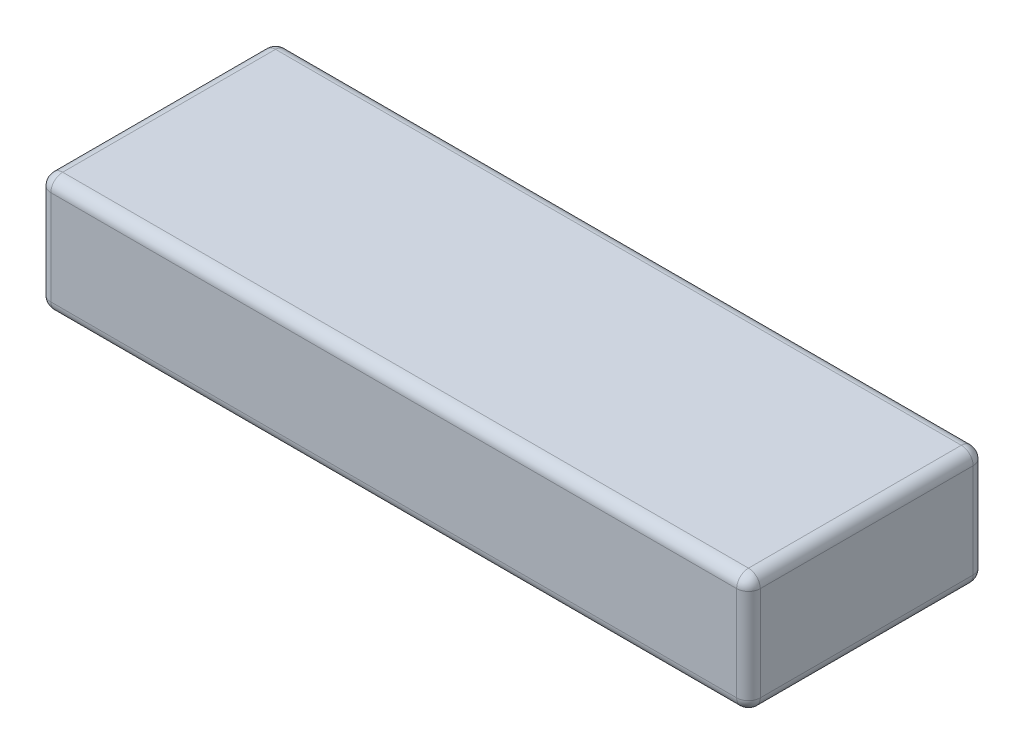
ISO-10303-21;
HEADER;
FILE_DESCRIPTION(('STEP AP214'),'2;1');
FILE_NAME('part.step','',(''),(''),'','','');
FILE_SCHEMA(('AUTOMOTIVE_DESIGN { 1 0 10303 214 1 1 1 1 }'));
ENDSEC;
DATA;
#1=APPLICATION_CONTEXT('core data for automotive mechanical design processes');
#2=APPLICATION_PROTOCOL_DEFINITION('international standard','automotive_design',2000,#1);
#3=PRODUCT_CONTEXT('',#1,'mechanical');
#4=PRODUCT('Part','Part','',(#3));
#5=PRODUCT_RELATED_PRODUCT_CATEGORY('part','',(#4));
#6=PRODUCT_DEFINITION_FORMATION('','',#4);
#7=PRODUCT_DEFINITION_CONTEXT('part definition',#1,'design');
#8=PRODUCT_DEFINITION('design','',#6,#7);
#9=PRODUCT_DEFINITION_SHAPE('','',#8);
#10=(LENGTH_UNIT() NAMED_UNIT(*) SI_UNIT(.MILLI.,.METRE.));
#11=(NAMED_UNIT(*) PLANE_ANGLE_UNIT() SI_UNIT($,.RADIAN.));
#12=(NAMED_UNIT(*) SI_UNIT($,.STERADIAN.) SOLID_ANGLE_UNIT());
#13=UNCERTAINTY_MEASURE_WITH_UNIT(LENGTH_MEASURE(1.E-05),#10,'distance_accuracy_value','');
#14=(GEOMETRIC_REPRESENTATION_CONTEXT(3) GLOBAL_UNCERTAINTY_ASSIGNED_CONTEXT((#13)) GLOBAL_UNIT_ASSIGNED_CONTEXT((#10,
#11,#12)) REPRESENTATION_CONTEXT('',''));
#15=CARTESIAN_POINT('',(0.,0.,0.));
#16=DIRECTION('',(0.,0.,1.));
#17=DIRECTION('',(1.,0.,0.));
#18=AXIS2_PLACEMENT_3D('',#15,#16,#17);
#19=CARTESIAN_POINT('',(30.,5.,-10.));
#20=DIRECTION('',(-1.,0.,0.));
#21=DIRECTION('',(0.,0.,1.));
#22=AXIS2_PLACEMENT_3D('',#19,#20,#21);
#23=PLANE('',#22);
#24=DIRECTION('',(0.,0.,-1.));
#25=VECTOR('',#24,1.);
#26=CARTESIAN_POINT('',(30.,4.,10.));
#27=LINE('',#26,#25);
#28=CARTESIAN_POINT('',(30.,4.,-9.));
#29=VERTEX_POINT('',#28);
#30=CARTESIAN_POINT('',(30.,4.,9.));
#31=VERTEX_POINT('',#30);
#32=EDGE_CURVE('E50',#29,#31,#27,.F.);
#33=ORIENTED_EDGE('',*,*,#32,.T.);
#34=DIRECTION('',(0.,-1.,0.));
#35=VECTOR('',#34,1.);
#36=CARTESIAN_POINT('',(30.,5.,9.));
#37=LINE('',#36,#35);
#38=CARTESIAN_POINT('',(30.,-4.,9.));
#39=VERTEX_POINT('',#38);
#40=EDGE_CURVE('E11',#31,#39,#37,.T.);
#41=ORIENTED_EDGE('',*,*,#40,.T.);
#42=DIRECTION('',(0.,0.,-1.));
#43=VECTOR('',#42,1.);
#44=CARTESIAN_POINT('',(30.,-4.,-10.));
#45=LINE('',#44,#43);
#46=CARTESIAN_POINT('',(30.,-4.,-9.));
#47=VERTEX_POINT('',#46);
#48=EDGE_CURVE('E226',#39,#47,#45,.T.);
#49=ORIENTED_EDGE('',*,*,#48,.T.);
#50=DIRECTION('',(0.,-1.,0.));
#51=VECTOR('',#50,1.);
#52=CARTESIAN_POINT('',(30.,5.,-9.));
#53=LINE('',#52,#51);
#54=EDGE_CURVE('E61',#47,#29,#53,.F.);
#55=ORIENTED_EDGE('',*,*,#54,.T.);
#56=EDGE_LOOP('',(#33,#41,#49,#55));
#57=FACE_BOUND('',#56,.T.);
#58=ADVANCED_FACE('F40',(#57),#23,.F.);
#59=CARTESIAN_POINT('',(-30.,5.,-10.));
#60=DIRECTION('',(0.,0.,1.));
#61=DIRECTION('',(1.,0.,0.));
#62=AXIS2_PLACEMENT_3D('',#59,#60,#61);
#63=PLANE('',#62);
#64=DIRECTION('',(0.,-1.,0.));
#65=VECTOR('',#64,1.);
#66=CARTESIAN_POINT('',(-29.,5.,-10.));
#67=LINE('',#66,#65);
#68=CARTESIAN_POINT('',(-29.,-4.,-10.));
#69=VERTEX_POINT('',#68);
#70=CARTESIAN_POINT('',(-29.,4.,-10.));
#71=VERTEX_POINT('',#70);
#72=EDGE_CURVE('E219',#69,#71,#67,.F.);
#73=ORIENTED_EDGE('',*,*,#72,.T.);
#74=DIRECTION('',(-1.,0.,0.));
#75=VECTOR('',#74,1.);
#76=CARTESIAN_POINT('',(30.,4.,-10.));
#77=LINE('',#76,#75);
#78=CARTESIAN_POINT('',(29.,4.,-10.));
#79=VERTEX_POINT('',#78);
#80=EDGE_CURVE('E222',#71,#79,#77,.F.);
#81=ORIENTED_EDGE('',*,*,#80,.T.);
#82=DIRECTION('',(0.,-1.,0.));
#83=VECTOR('',#82,1.);
#84=CARTESIAN_POINT('',(29.,5.,-10.));
#85=LINE('',#84,#83);
#86=CARTESIAN_POINT('',(29.,-4.,-10.));
#87=VERTEX_POINT('',#86);
#88=EDGE_CURVE('E213',#79,#87,#85,.T.);
#89=ORIENTED_EDGE('',*,*,#88,.T.);
#90=DIRECTION('',(-1.,0.,0.));
#91=VECTOR('',#90,1.);
#92=CARTESIAN_POINT('',(-30.,-4.,-10.));
#93=LINE('',#92,#91);
#94=EDGE_CURVE('E216',#87,#69,#93,.T.);
#95=ORIENTED_EDGE('',*,*,#94,.T.);
#96=EDGE_LOOP('',(#73,#81,#89,#95));
#97=FACE_BOUND('',#96,.T.);
#98=ADVANCED_FACE('F359',(#97),#63,.F.);
#99=CARTESIAN_POINT('',(-30.,5.,-10.));
#100=DIRECTION('',(1.,0.,0.));
#101=DIRECTION('',(0.,0.,-1.));
#102=AXIS2_PLACEMENT_3D('',#99,#100,#101);
#103=PLANE('',#102);
#104=DIRECTION('',(0.,-1.,0.));
#105=VECTOR('',#104,1.);
#106=CARTESIAN_POINT('',(-30.,5.,9.));
#107=LINE('',#106,#105);
#108=CARTESIAN_POINT('',(-30.,-4.,9.));
#109=VERTEX_POINT('',#108);
#110=CARTESIAN_POINT('',(-30.,4.,9.));
#111=VERTEX_POINT('',#110);
#112=EDGE_CURVE('E206',#109,#111,#107,.F.);
#113=ORIENTED_EDGE('',*,*,#112,.T.);
#114=DIRECTION('',(0.,0.,1.));
#115=VECTOR('',#114,1.);
#116=CARTESIAN_POINT('',(-30.,4.,-10.));
#117=LINE('',#116,#115);
#118=CARTESIAN_POINT('',(-30.,4.,-9.));
#119=VERTEX_POINT('',#118);
#120=EDGE_CURVE('E209',#111,#119,#117,.F.);
#121=ORIENTED_EDGE('',*,*,#120,.T.);
#122=DIRECTION('',(0.,-1.,0.));
#123=VECTOR('',#122,1.);
#124=CARTESIAN_POINT('',(-30.,5.,-9.));
#125=LINE('',#124,#123);
#126=CARTESIAN_POINT('',(-30.,-4.,-9.));
#127=VERTEX_POINT('',#126);
#128=EDGE_CURVE('E200',#119,#127,#125,.T.);
#129=ORIENTED_EDGE('',*,*,#128,.T.);
#130=DIRECTION('',(0.,0.,1.));
#131=VECTOR('',#130,1.);
#132=CARTESIAN_POINT('',(-30.,-4.,-10.));
#133=LINE('',#132,#131);
#134=EDGE_CURVE('E203',#127,#109,#133,.T.);
#135=ORIENTED_EDGE('',*,*,#134,.T.);
#136=EDGE_LOOP('',(#113,#121,#129,#135));
#137=FACE_BOUND('',#136,.T.);
#138=ADVANCED_FACE('F330',(#137),#103,.F.);
#139=CARTESIAN_POINT('',(-30.,5.,10.));
#140=DIRECTION('',(0.,0.,-1.));
#141=DIRECTION('',(-1.,0.,0.));
#142=AXIS2_PLACEMENT_3D('',#139,#140,#141);
#143=PLANE('',#142);
#144=DIRECTION('',(1.,0.,0.));
#145=VECTOR('',#144,1.);
#146=CARTESIAN_POINT('',(-30.,4.,10.));
#147=LINE('',#146,#145);
#148=CARTESIAN_POINT('',(29.,4.,10.));
#149=VERTEX_POINT('',#148);
#150=CARTESIAN_POINT('',(-29.,4.,10.));
#151=VERTEX_POINT('',#150);
#152=EDGE_CURVE('E162',#149,#151,#147,.F.);
#153=ORIENTED_EDGE('',*,*,#152,.T.);
#154=DIRECTION('',(0.,-1.,0.));
#155=VECTOR('',#154,1.);
#156=CARTESIAN_POINT('',(-29.,5.,10.));
#157=LINE('',#156,#155);
#158=CARTESIAN_POINT('',(-29.,-4.,10.));
#159=VERTEX_POINT('',#158);
#160=EDGE_CURVE('E166',#151,#159,#157,.T.);
#161=ORIENTED_EDGE('',*,*,#160,.T.);
#162=DIRECTION('',(1.,0.,0.));
#163=VECTOR('',#162,1.);
#164=CARTESIAN_POINT('',(-30.,-4.,10.));
#165=LINE('',#164,#163);
#166=CARTESIAN_POINT('',(29.,-4.,10.));
#167=VERTEX_POINT('',#166);
#168=EDGE_CURVE('E135',#159,#167,#165,.T.);
#169=ORIENTED_EDGE('',*,*,#168,.T.);
#170=DIRECTION('',(0.,-1.,0.));
#171=VECTOR('',#170,1.);
#172=CARTESIAN_POINT('',(29.,5.,10.));
#173=LINE('',#172,#171);
#174=EDGE_CURVE('E155',#167,#149,#173,.F.);
#175=ORIENTED_EDGE('',*,*,#174,.T.);
#176=EDGE_LOOP('',(#153,#161,#169,#175));
#177=FACE_BOUND('',#176,.T.);
#178=ADVANCED_FACE('F164',(#177),#143,.F.);
#179=CARTESIAN_POINT('',(0.,5.,0.));
#180=DIRECTION('',(0.,1.,0.));
#181=DIRECTION('',(0.,0.,1.));
#182=AXIS2_PLACEMENT_3D('',#179,#180,#181);
#183=PLANE('',#182);
#184=DIRECTION('',(0.,0.,1.));
#185=VECTOR('',#184,1.);
#186=CARTESIAN_POINT('',(-29.,5.,10.));
#187=LINE('',#186,#185);
#188=CARTESIAN_POINT('',(-29.,5.,-9.));
#189=VERTEX_POINT('',#188);
#190=CARTESIAN_POINT('',(-29.,5.,9.));
#191=VERTEX_POINT('',#190);
#192=EDGE_CURVE('E193',#189,#191,#187,.T.);
#193=ORIENTED_EDGE('',*,*,#192,.T.);
#194=DIRECTION('',(1.,0.,0.));
#195=VECTOR('',#194,1.);
#196=CARTESIAN_POINT('',(30.,5.,9.));
#197=LINE('',#196,#195);
#198=CARTESIAN_POINT('',(29.,5.,9.));
#199=VERTEX_POINT('',#198);
#200=EDGE_CURVE('E196',#191,#199,#197,.T.);
#201=ORIENTED_EDGE('',*,*,#200,.T.);
#202=DIRECTION('',(0.,0.,-1.));
#203=VECTOR('',#202,1.);
#204=CARTESIAN_POINT('',(29.,5.,-10.));
#205=LINE('',#204,#203);
#206=CARTESIAN_POINT('',(29.,5.,-9.));
#207=VERTEX_POINT('',#206);
#208=EDGE_CURVE('E187',#199,#207,#205,.T.);
#209=ORIENTED_EDGE('',*,*,#208,.T.);
#210=DIRECTION('',(-1.,0.,0.));
#211=VECTOR('',#210,1.);
#212=CARTESIAN_POINT('',(-30.,5.,-9.));
#213=LINE('',#212,#211);
#214=EDGE_CURVE('E190',#207,#189,#213,.T.);
#215=ORIENTED_EDGE('',*,*,#214,.T.);
#216=EDGE_LOOP('',(#193,#201,#209,#215));
#217=FACE_BOUND('',#216,.T.);
#218=ADVANCED_FACE('F425',(#217),#183,.T.);
#219=CARTESIAN_POINT('',(0.,-5.,0.));
#220=DIRECTION('',(0.,1.,0.));
#221=DIRECTION('',(0.,0.,1.));
#222=AXIS2_PLACEMENT_3D('',#219,#220,#221);
#223=PLANE('',#222);
#224=DIRECTION('',(0.,0.,-1.));
#225=VECTOR('',#224,1.);
#226=CARTESIAN_POINT('',(29.,-5.,0.));
#227=LINE('',#226,#225);
#228=CARTESIAN_POINT('',(29.,-5.,-9.));
#229=VERTEX_POINT('',#228);
#230=CARTESIAN_POINT('',(29.,-5.,9.));
#231=VERTEX_POINT('',#230);
#232=EDGE_CURVE('E173',#229,#231,#227,.F.);
#233=ORIENTED_EDGE('',*,*,#232,.T.);
#234=DIRECTION('',(1.,0.,0.));
#235=VECTOR('',#234,1.);
#236=CARTESIAN_POINT('',(0.,-5.,9.));
#237=LINE('',#236,#235);
#238=CARTESIAN_POINT('',(-29.,-5.,9.));
#239=VERTEX_POINT('',#238);
#240=EDGE_CURVE('E137',#231,#239,#237,.F.);
#241=ORIENTED_EDGE('',*,*,#240,.T.);
#242=DIRECTION('',(0.,0.,1.));
#243=VECTOR('',#242,1.);
#244=CARTESIAN_POINT('',(-29.,-5.,0.));
#245=LINE('',#244,#243);
#246=CARTESIAN_POINT('',(-29.,-5.,-9.));
#247=VERTEX_POINT('',#246);
#248=EDGE_CURVE('E182',#239,#247,#245,.F.);
#249=ORIENTED_EDGE('',*,*,#248,.T.);
#250=DIRECTION('',(-1.,0.,0.));
#251=VECTOR('',#250,1.);
#252=CARTESIAN_POINT('',(0.,-5.,-9.));
#253=LINE('',#252,#251);
#254=EDGE_CURVE('E179',#247,#229,#253,.F.);
#255=ORIENTED_EDGE('',*,*,#254,.T.);
#256=EDGE_LOOP('',(#233,#241,#249,#255));
#257=FACE_BOUND('',#256,.T.);
#258=ADVANCED_FACE('F352',(#257),#223,.F.);
#259=CARTESIAN_POINT('',(0.,4.,-9.));
#260=DIRECTION('',(1.,0.,0.));
#261=DIRECTION('',(0.,0.,-1.));
#262=AXIS2_PLACEMENT_3D('',#259,#260,#261);
#263=CYLINDRICAL_SURFACE('',#262,1.);
#264=CARTESIAN_POINT('',(-29.,4.,-9.));
#265=DIRECTION('',(-1.,0.,0.));
#266=DIRECTION('',(0.,0.,1.));
#267=AXIS2_PLACEMENT_3D('',#264,#265,#266);
#268=CIRCLE('',#267,1.);
#269=EDGE_CURVE('E44',#189,#71,#268,.T.);
#270=ORIENTED_EDGE('',*,*,#269,.F.);
#271=ORIENTED_EDGE('',*,*,#214,.F.);
#272=CARTESIAN_POINT('',(29.,4.,-9.));
#273=DIRECTION('',(1.,0.,0.));
#274=DIRECTION('',(0.,0.,-1.));
#275=AXIS2_PLACEMENT_3D('',#272,#273,#274);
#276=CIRCLE('',#275,1.);
#277=EDGE_CURVE('E303',#79,#207,#276,.T.);
#278=ORIENTED_EDGE('',*,*,#277,.F.);
#279=ORIENTED_EDGE('',*,*,#80,.F.);
#280=EDGE_LOOP('',(#270,#271,#278,#279));
#281=FACE_BOUND('',#280,.T.);
#282=ADVANCED_FACE('F42',(#281),#263,.T.);
#283=CARTESIAN_POINT('',(-29.,4.,-9.));
#284=DIRECTION('',(0.,0.,-1.));
#285=DIRECTION('',(-1.,0.,0.));
#286=AXIS2_PLACEMENT_3D('',#283,#284,#285);
#287=SPHERICAL_SURFACE('',#286,1.);
#288=CARTESIAN_POINT('',(-29.,4.,-9.));
#289=DIRECTION('',(0.,0.,-1.));
#290=DIRECTION('',(-1.,0.,0.));
#291=AXIS2_PLACEMENT_3D('',#288,#289,#290);
#292=CIRCLE('',#291,1.);
#293=EDGE_CURVE('E296',#189,#119,#292,.F.);
#294=ORIENTED_EDGE('',*,*,#293,.F.);
#295=ORIENTED_EDGE('',*,*,#269,.T.);
#296=CARTESIAN_POINT('',(-29.,4.,-9.));
#297=DIRECTION('',(0.,1.,0.));
#298=DIRECTION('',(0.,0.,1.));
#299=AXIS2_PLACEMENT_3D('',#296,#297,#298);
#300=CIRCLE('',#299,1.);
#301=EDGE_CURVE('E300',#119,#71,#300,.F.);
#302=ORIENTED_EDGE('',*,*,#301,.F.);
#303=EDGE_LOOP('',(#294,#295,#302));
#304=FACE_BOUND('',#303,.T.);
#305=ADVANCED_FACE('F318',(#304),#287,.T.);
#306=CARTESIAN_POINT('',(29.,4.,-9.));
#307=DIRECTION('',(0.,1.,0.));
#308=DIRECTION('',(0.,0.,1.));
#309=AXIS2_PLACEMENT_3D('',#306,#307,#308);
#310=SPHERICAL_SURFACE('',#309,1.);
#311=CARTESIAN_POINT('',(29.,4.,-9.));
#312=DIRECTION('',(0.,1.,0.));
#313=DIRECTION('',(0.,0.,1.));
#314=AXIS2_PLACEMENT_3D('',#311,#312,#313);
#315=CIRCLE('',#314,1.);
#316=EDGE_CURVE('E289',#79,#29,#315,.F.);
#317=ORIENTED_EDGE('',*,*,#316,.F.);
#318=ORIENTED_EDGE('',*,*,#277,.T.);
#319=CARTESIAN_POINT('',(29.,4.,-9.));
#320=DIRECTION('',(0.,0.,-1.));
#321=DIRECTION('',(-1.,0.,0.));
#322=AXIS2_PLACEMENT_3D('',#319,#320,#321);
#323=CIRCLE('',#322,1.);
#324=EDGE_CURVE('E292',#29,#207,#323,.F.);
#325=ORIENTED_EDGE('',*,*,#324,.F.);
#326=EDGE_LOOP('',(#317,#318,#325));
#327=FACE_BOUND('',#326,.T.);
#328=ADVANCED_FACE('F416',(#327),#310,.T.);
#329=CARTESIAN_POINT('',(-29.,5.,-9.));
#330=DIRECTION('',(0.,-1.,0.));
#331=DIRECTION('',(0.,0.,-1.));
#332=AXIS2_PLACEMENT_3D('',#329,#330,#331);
#333=CYLINDRICAL_SURFACE('',#332,1.);
#334=ORIENTED_EDGE('',*,*,#301,.T.);
#335=ORIENTED_EDGE('',*,*,#72,.F.);
#336=CARTESIAN_POINT('',(-29.,-4.,-9.));
#337=DIRECTION('',(0.,-1.,0.));
#338=DIRECTION('',(0.,0.,-1.));
#339=AXIS2_PLACEMENT_3D('',#336,#337,#338);
#340=CIRCLE('',#339,1.);
#341=EDGE_CURVE('E281',#127,#69,#340,.T.);
#342=ORIENTED_EDGE('',*,*,#341,.F.);
#343=ORIENTED_EDGE('',*,*,#128,.F.);
#344=EDGE_LOOP('',(#334,#335,#342,#343));
#345=FACE_BOUND('',#344,.T.);
#346=ADVANCED_FACE('F325',(#345),#333,.T.);
#347=CARTESIAN_POINT('',(-29.,4.,0.));
#348=DIRECTION('',(0.,0.,-1.));
#349=DIRECTION('',(-1.,0.,0.));
#350=AXIS2_PLACEMENT_3D('',#347,#348,#349);
#351=CYLINDRICAL_SURFACE('',#350,1.);
#352=ORIENTED_EDGE('',*,*,#293,.T.);
#353=ORIENTED_EDGE('',*,*,#120,.F.);
#354=CARTESIAN_POINT('',(-29.,4.,9.));
#355=DIRECTION('',(0.,0.,1.));
#356=DIRECTION('',(1.,0.,0.));
#357=AXIS2_PLACEMENT_3D('',#354,#355,#356);
#358=CIRCLE('',#357,1.);
#359=EDGE_CURVE('E277',#191,#111,#358,.T.);
#360=ORIENTED_EDGE('',*,*,#359,.F.);
#361=ORIENTED_EDGE('',*,*,#192,.F.);
#362=EDGE_LOOP('',(#352,#353,#360,#361));
#363=FACE_BOUND('',#362,.T.);
#364=ADVANCED_FACE('F336',(#363),#351,.T.);
#365=CARTESIAN_POINT('',(0.,4.,9.));
#366=DIRECTION('',(-1.,0.,0.));
#367=DIRECTION('',(0.,0.,1.));
#368=AXIS2_PLACEMENT_3D('',#365,#366,#367);
#369=CYLINDRICAL_SURFACE('',#368,1.);
#370=CARTESIAN_POINT('',(29.,4.,9.));
#371=DIRECTION('',(1.,0.,0.));
#372=DIRECTION('',(0.,0.,-1.));
#373=AXIS2_PLACEMENT_3D('',#370,#371,#372);
#374=CIRCLE('',#373,1.);
#375=EDGE_CURVE('E269',#199,#149,#374,.T.);
#376=ORIENTED_EDGE('',*,*,#375,.F.);
#377=ORIENTED_EDGE('',*,*,#200,.F.);
#378=CARTESIAN_POINT('',(-29.,4.,9.));
#379=DIRECTION('',(-1.,0.,0.));
#380=DIRECTION('',(0.,-1.,0.));
#381=AXIS2_PLACEMENT_3D('',#378,#379,#380);
#382=CIRCLE('',#381,1.);
#383=EDGE_CURVE('E273',#151,#191,#382,.T.);
#384=ORIENTED_EDGE('',*,*,#383,.F.);
#385=ORIENTED_EDGE('',*,*,#152,.F.);
#386=EDGE_LOOP('',(#376,#377,#384,#385));
#387=FACE_BOUND('',#386,.T.);
#388=ADVANCED_FACE('F407',(#387),#369,.T.);
#389=CARTESIAN_POINT('',(29.,4.,0.));
#390=DIRECTION('',(0.,0.,1.));
#391=DIRECTION('',(1.,0.,0.));
#392=AXIS2_PLACEMENT_3D('',#389,#390,#391);
#393=CYLINDRICAL_SURFACE('',#392,1.);
#394=ORIENTED_EDGE('',*,*,#324,.T.);
#395=ORIENTED_EDGE('',*,*,#208,.F.);
#396=CARTESIAN_POINT('',(29.,4.,9.));
#397=DIRECTION('',(0.,0.,1.));
#398=DIRECTION('',(0.,-1.,0.));
#399=AXIS2_PLACEMENT_3D('',#396,#397,#398);
#400=CIRCLE('',#399,1.);
#401=EDGE_CURVE('E266',#31,#199,#400,.T.);
#402=ORIENTED_EDGE('',*,*,#401,.F.);
#403=ORIENTED_EDGE('',*,*,#32,.F.);
#404=EDGE_LOOP('',(#394,#395,#402,#403));
#405=FACE_BOUND('',#404,.T.);
#406=ADVANCED_FACE('F403',(#405),#393,.T.);
#407=CARTESIAN_POINT('',(29.,5.,-9.));
#408=DIRECTION('',(0.,-1.,0.));
#409=DIRECTION('',(0.,0.,-1.));
#410=AXIS2_PLACEMENT_3D('',#407,#408,#409);
#411=CYLINDRICAL_SURFACE('',#410,1.);
#412=ORIENTED_EDGE('',*,*,#316,.T.);
#413=ORIENTED_EDGE('',*,*,#54,.F.);
#414=CARTESIAN_POINT('',(29.,-4.,-9.));
#415=DIRECTION('',(0.,-1.,0.));
#416=DIRECTION('',(0.,0.,-1.));
#417=AXIS2_PLACEMENT_3D('',#414,#415,#416);
#418=CIRCLE('',#417,1.);
#419=EDGE_CURVE('E262',#87,#47,#418,.T.);
#420=ORIENTED_EDGE('',*,*,#419,.F.);
#421=ORIENTED_EDGE('',*,*,#88,.F.);
#422=EDGE_LOOP('',(#412,#413,#420,#421));
#423=FACE_BOUND('',#422,.T.);
#424=ADVANCED_FACE('F399',(#423),#411,.T.);
#425=CARTESIAN_POINT('',(-30.,-4.,-9.));
#426=DIRECTION('',(-1.,0.,0.));
#427=DIRECTION('',(0.,0.,1.));
#428=AXIS2_PLACEMENT_3D('',#425,#426,#427);
#429=CYLINDRICAL_SURFACE('',#428,1.);
#430=CARTESIAN_POINT('',(-29.,-4.,-9.));
#431=DIRECTION('',(-1.,0.,0.));
#432=DIRECTION('',(0.,0.,1.));
#433=AXIS2_PLACEMENT_3D('',#430,#431,#432);
#434=CIRCLE('',#433,1.);
#435=EDGE_CURVE('E285',#69,#247,#434,.T.);
#436=ORIENTED_EDGE('',*,*,#435,.F.);
#437=ORIENTED_EDGE('',*,*,#94,.F.);
#438=CARTESIAN_POINT('',(29.,-4.,-9.));
#439=DIRECTION('',(1.,0.,0.));
#440=DIRECTION('',(0.,0.,-1.));
#441=AXIS2_PLACEMENT_3D('',#438,#439,#440);
#442=CIRCLE('',#441,1.);
#443=EDGE_CURVE('E258',#229,#87,#442,.T.);
#444=ORIENTED_EDGE('',*,*,#443,.F.);
#445=ORIENTED_EDGE('',*,*,#254,.F.);
#446=EDGE_LOOP('',(#436,#437,#444,#445));
#447=FACE_BOUND('',#446,.T.);
#448=ADVANCED_FACE('F395',(#447),#429,.T.);
#449=CARTESIAN_POINT('',(-29.,-4.,-9.));
#450=DIRECTION('',(0.,0.,-1.));
#451=DIRECTION('',(0.,1.,0.));
#452=AXIS2_PLACEMENT_3D('',#449,#450,#451);
#453=SPHERICAL_SURFACE('',#452,1.);
#454=ORIENTED_EDGE('',*,*,#341,.T.);
#455=ORIENTED_EDGE('',*,*,#435,.T.);
#456=CARTESIAN_POINT('',(-29.,-4.,-9.));
#457=DIRECTION('',(0.,0.,-1.));
#458=DIRECTION('',(-1.,0.,0.));
#459=AXIS2_PLACEMENT_3D('',#456,#457,#458);
#460=CIRCLE('',#459,1.);
#461=EDGE_CURVE('E254',#127,#247,#460,.F.);
#462=ORIENTED_EDGE('',*,*,#461,.F.);
#463=EDGE_LOOP('',(#454,#455,#462));
#464=FACE_BOUND('',#463,.T.);
#465=ADVANCED_FACE('F392',(#464),#453,.T.);
#466=CARTESIAN_POINT('',(-29.,4.,9.));
#467=DIRECTION('',(0.,1.,0.));
#468=DIRECTION('',(-1.,0.,0.));
#469=AXIS2_PLACEMENT_3D('',#466,#467,#468);
#470=SPHERICAL_SURFACE('',#469,1.);
#471=ORIENTED_EDGE('',*,*,#383,.T.);
#472=ORIENTED_EDGE('',*,*,#359,.T.);
#473=CARTESIAN_POINT('',(-29.,4.,9.));
#474=DIRECTION('',(0.,1.,0.));
#475=DIRECTION('',(0.,0.,1.));
#476=AXIS2_PLACEMENT_3D('',#473,#474,#475);
#477=CIRCLE('',#476,1.);
#478=EDGE_CURVE('E250',#151,#111,#477,.F.);
#479=ORIENTED_EDGE('',*,*,#478,.F.);
#480=EDGE_LOOP('',(#471,#472,#479));
#481=FACE_BOUND('',#480,.T.);
#482=ADVANCED_FACE('F339',(#481),#470,.T.);
#483=CARTESIAN_POINT('',(29.,4.,9.));
#484=DIRECTION('',(0.,1.,0.));
#485=DIRECTION('',(0.,0.,1.));
#486=AXIS2_PLACEMENT_3D('',#483,#484,#485);
#487=SPHERICAL_SURFACE('',#486,1.);
#488=ORIENTED_EDGE('',*,*,#401,.T.);
#489=ORIENTED_EDGE('',*,*,#375,.T.);
#490=CARTESIAN_POINT('',(29.,4.,9.));
#491=DIRECTION('',(0.,1.,0.));
#492=DIRECTION('',(0.,0.,1.));
#493=AXIS2_PLACEMENT_3D('',#490,#491,#492);
#494=CIRCLE('',#493,1.);
#495=EDGE_CURVE('E158',#31,#149,#494,.F.);
#496=ORIENTED_EDGE('',*,*,#495,.F.);
#497=EDGE_LOOP('',(#488,#489,#496));
#498=FACE_BOUND('',#497,.T.);
#499=ADVANCED_FACE('F385',(#498),#487,.T.);
#500=CARTESIAN_POINT('',(29.,-4.,-9.));
#501=DIRECTION('',(0.,0.,-1.));
#502=DIRECTION('',(0.,1.,0.));
#503=AXIS2_PLACEMENT_3D('',#500,#501,#502);
#504=SPHERICAL_SURFACE('',#503,1.);
#505=ORIENTED_EDGE('',*,*,#443,.T.);
#506=ORIENTED_EDGE('',*,*,#419,.T.);
#507=CARTESIAN_POINT('',(29.,-4.,-9.));
#508=DIRECTION('',(0.,0.,-1.));
#509=DIRECTION('',(-1.,0.,0.));
#510=AXIS2_PLACEMENT_3D('',#507,#508,#509);
#511=CIRCLE('',#510,1.);
#512=EDGE_CURVE('E244',#229,#47,#511,.F.);
#513=ORIENTED_EDGE('',*,*,#512,.F.);
#514=EDGE_LOOP('',(#505,#506,#513));
#515=FACE_BOUND('',#514,.T.);
#516=ADVANCED_FACE('F382',(#515),#504,.T.);
#517=CARTESIAN_POINT('',(-29.,-4.,-10.));
#518=DIRECTION('',(0.,0.,1.));
#519=DIRECTION('',(1.,0.,0.));
#520=AXIS2_PLACEMENT_3D('',#517,#518,#519);
#521=CYLINDRICAL_SURFACE('',#520,1.);
#522=ORIENTED_EDGE('',*,*,#461,.T.);
#523=ORIENTED_EDGE('',*,*,#248,.F.);
#524=CARTESIAN_POINT('',(-29.,-4.,9.));
#525=DIRECTION('',(0.,0.,1.));
#526=DIRECTION('',(1.,0.,0.));
#527=AXIS2_PLACEMENT_3D('',#524,#525,#526);
#528=CIRCLE('',#527,1.);
#529=EDGE_CURVE('E240',#109,#239,#528,.T.);
#530=ORIENTED_EDGE('',*,*,#529,.F.);
#531=ORIENTED_EDGE('',*,*,#134,.F.);
#532=EDGE_LOOP('',(#522,#523,#530,#531));
#533=FACE_BOUND('',#532,.T.);
#534=ADVANCED_FACE('F349',(#533),#521,.T.);
#535=CARTESIAN_POINT('',(-29.,5.,9.));
#536=DIRECTION('',(0.,-1.,0.));
#537=DIRECTION('',(0.,0.,-1.));
#538=AXIS2_PLACEMENT_3D('',#535,#536,#537);
#539=CYLINDRICAL_SURFACE('',#538,1.);
#540=ORIENTED_EDGE('',*,*,#478,.T.);
#541=ORIENTED_EDGE('',*,*,#112,.F.);
#542=CARTESIAN_POINT('',(-29.,-4.,9.));
#543=DIRECTION('',(0.,-1.,0.));
#544=DIRECTION('',(0.,0.,-1.));
#545=AXIS2_PLACEMENT_3D('',#542,#543,#544);
#546=CIRCLE('',#545,1.);
#547=EDGE_CURVE('E152',#159,#109,#546,.T.);
#548=ORIENTED_EDGE('',*,*,#547,.F.);
#549=ORIENTED_EDGE('',*,*,#160,.F.);
#550=EDGE_LOOP('',(#540,#541,#548,#549));
#551=FACE_BOUND('',#550,.T.);
#552=ADVANCED_FACE('F342',(#551),#539,.T.);
#553=CARTESIAN_POINT('',(29.,5.,9.));
#554=DIRECTION('',(0.,-1.,0.));
#555=DIRECTION('',(0.,0.,-1.));
#556=AXIS2_PLACEMENT_3D('',#553,#554,#555);
#557=CYLINDRICAL_SURFACE('',#556,1.);
#558=ORIENTED_EDGE('',*,*,#495,.T.);
#559=ORIENTED_EDGE('',*,*,#174,.F.);
#560=CARTESIAN_POINT('',(29.,-4.,9.));
#561=DIRECTION('',(0.,-1.,0.));
#562=DIRECTION('',(0.,0.,-1.));
#563=AXIS2_PLACEMENT_3D('',#560,#561,#562);
#564=CIRCLE('',#563,1.);
#565=EDGE_CURVE('E143',#39,#167,#564,.T.);
#566=ORIENTED_EDGE('',*,*,#565,.F.);
#567=ORIENTED_EDGE('',*,*,#40,.F.);
#568=EDGE_LOOP('',(#558,#559,#566,#567));
#569=FACE_BOUND('',#568,.T.);
#570=ADVANCED_FACE('F156',(#569),#557,.T.);
#571=CARTESIAN_POINT('',(29.,-4.,-10.));
#572=DIRECTION('',(0.,0.,-1.));
#573=DIRECTION('',(-1.,0.,0.));
#574=AXIS2_PLACEMENT_3D('',#571,#572,#573);
#575=CYLINDRICAL_SURFACE('',#574,1.);
#576=ORIENTED_EDGE('',*,*,#512,.T.);
#577=ORIENTED_EDGE('',*,*,#48,.F.);
#578=CARTESIAN_POINT('',(29.,-4.,9.));
#579=DIRECTION('',(0.,0.,1.));
#580=DIRECTION('',(1.,0.,0.));
#581=AXIS2_PLACEMENT_3D('',#578,#579,#580);
#582=CIRCLE('',#581,1.);
#583=EDGE_CURVE('E147',#231,#39,#582,.T.);
#584=ORIENTED_EDGE('',*,*,#583,.F.);
#585=ORIENTED_EDGE('',*,*,#232,.F.);
#586=EDGE_LOOP('',(#576,#577,#584,#585));
#587=FACE_BOUND('',#586,.T.);
#588=ADVANCED_FACE('F356',(#587),#575,.T.);
#589=CARTESIAN_POINT('',(-29.,-4.,9.));
#590=DIRECTION('',(-1.,0.,0.));
#591=DIRECTION('',(0.,-1.,0.));
#592=AXIS2_PLACEMENT_3D('',#589,#590,#591);
#593=SPHERICAL_SURFACE('',#592,1.);
#594=ORIENTED_EDGE('',*,*,#547,.T.);
#595=ORIENTED_EDGE('',*,*,#529,.T.);
#596=CARTESIAN_POINT('',(-29.,-4.,9.));
#597=DIRECTION('',(-1.,0.,0.));
#598=DIRECTION('',(0.,0.,1.));
#599=AXIS2_PLACEMENT_3D('',#596,#597,#598);
#600=CIRCLE('',#599,1.);
#601=EDGE_CURVE('E140',#159,#239,#600,.F.);
#602=ORIENTED_EDGE('',*,*,#601,.F.);
#603=EDGE_LOOP('',(#594,#595,#602));
#604=FACE_BOUND('',#603,.T.);
#605=ADVANCED_FACE('F346',(#604),#593,.T.);
#606=CARTESIAN_POINT('',(29.,-4.,9.));
#607=DIRECTION('',(1.,0.,0.));
#608=DIRECTION('',(0.,0.,-1.));
#609=AXIS2_PLACEMENT_3D('',#606,#607,#608);
#610=SPHERICAL_SURFACE('',#609,1.);
#611=ORIENTED_EDGE('',*,*,#583,.T.);
#612=ORIENTED_EDGE('',*,*,#565,.T.);
#613=CARTESIAN_POINT('',(29.,-4.,9.));
#614=DIRECTION('',(1.,0.,0.));
#615=DIRECTION('',(0.,0.,-1.));
#616=AXIS2_PLACEMENT_3D('',#613,#614,#615);
#617=CIRCLE('',#616,1.);
#618=EDGE_CURVE('E131',#231,#167,#617,.F.);
#619=ORIENTED_EDGE('',*,*,#618,.F.);
#620=EDGE_LOOP('',(#611,#612,#619));
#621=FACE_BOUND('',#620,.T.);
#622=ADVANCED_FACE('F145',(#621),#610,.T.);
#623=CARTESIAN_POINT('',(-30.,-4.,9.));
#624=DIRECTION('',(1.,0.,0.));
#625=DIRECTION('',(0.,0.,-1.));
#626=AXIS2_PLACEMENT_3D('',#623,#624,#625);
#627=CYLINDRICAL_SURFACE('',#626,1.);
#628=ORIENTED_EDGE('',*,*,#601,.T.);
#629=ORIENTED_EDGE('',*,*,#240,.F.);
#630=ORIENTED_EDGE('',*,*,#618,.T.);
#631=ORIENTED_EDGE('',*,*,#168,.F.);
#632=EDGE_LOOP('',(#628,#629,#630,#631));
#633=FACE_BOUND('',#632,.T.);
#634=ADVANCED_FACE('F133',(#633),#627,.T.);
#635=CLOSED_SHELL('',(#58,#98,#138,#178,#218,#258,#282,#305,#328,#346,#364,#388,#406,#424,#448,
#465,#482,#499,#516,#534,#552,#570,#588,#605,#622,#634));
#636=MANIFOLD_SOLID_BREP('B2',#635);
#637=ADVANCED_BREP_SHAPE_REPRESENTATION('',(#18,#636),#14);
#638=SHAPE_DEFINITION_REPRESENTATION(#9,#637);
ENDSEC;
END-ISO-10303-21;
